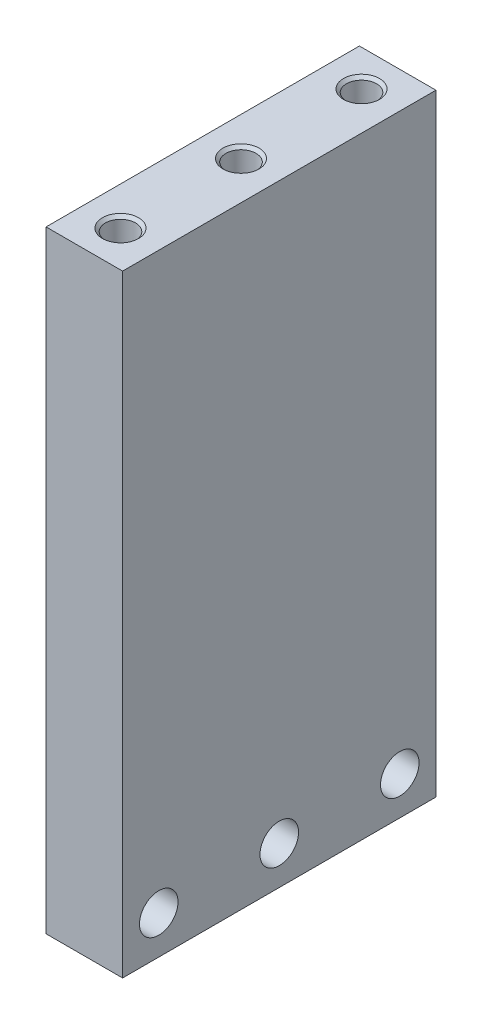
ISO-10303-21;
HEADER;
FILE_DESCRIPTION(('STEP AP214'),'2;1');
FILE_NAME('part.step','',(''),(''),'','','');
FILE_SCHEMA(('AUTOMOTIVE_DESIGN { 1 0 10303 214 1 1 1 1 }'));
ENDSEC;
DATA;
#1=APPLICATION_CONTEXT('core data for automotive mechanical design processes');
#2=APPLICATION_PROTOCOL_DEFINITION('international standard','automotive_design',2000,#1);
#3=PRODUCT_CONTEXT('',#1,'mechanical');
#4=PRODUCT('Part','Part','',(#3));
#5=PRODUCT_RELATED_PRODUCT_CATEGORY('part','',(#4));
#6=PRODUCT_DEFINITION_FORMATION('','',#4);
#7=PRODUCT_DEFINITION_CONTEXT('part definition',#1,'design');
#8=PRODUCT_DEFINITION('design','',#6,#7);
#9=PRODUCT_DEFINITION_SHAPE('','',#8);
#10=(LENGTH_UNIT() NAMED_UNIT(*) SI_UNIT(.MILLI.,.METRE.));
#11=(NAMED_UNIT(*) PLANE_ANGLE_UNIT() SI_UNIT($,.RADIAN.));
#12=(NAMED_UNIT(*) SI_UNIT($,.STERADIAN.) SOLID_ANGLE_UNIT());
#13=UNCERTAINTY_MEASURE_WITH_UNIT(LENGTH_MEASURE(1.E-05),#10,'distance_accuracy_value','');
#14=(GEOMETRIC_REPRESENTATION_CONTEXT(3) GLOBAL_UNCERTAINTY_ASSIGNED_CONTEXT((#13)) GLOBAL_UNIT_ASSIGNED_CONTEXT((#10,
#11,#12)) REPRESENTATION_CONTEXT('',''));
#15=CARTESIAN_POINT('',(0.,0.,0.));
#16=DIRECTION('',(0.,0.,1.));
#17=DIRECTION('',(1.,0.,0.));
#18=AXIS2_PLACEMENT_3D('',#15,#16,#17);
#19=CARTESIAN_POINT('',(0.,0.,26.));
#20=DIRECTION('',(1.,0.,0.));
#21=DIRECTION('',(0.,0.,-1.));
#22=AXIS2_PLACEMENT_3D('',#19,#20,#21);
#23=PLANE('',#22);
#24=CARTESIAN_POINT('',(0.,3.175,3.));
#25=DIRECTION('',(1.,0.,0.));
#26=DIRECTION('',(0.,0.,-1.));
#27=AXIS2_PLACEMENT_3D('',#24,#25,#26);
#28=CIRCLE('',#27,1.6);
#29=CARTESIAN_POINT('',(0.,3.175,1.4));
#30=VERTEX_POINT('',#29);
#31=EDGE_CURVE('E109',#30,#30,#28,.T.);
#32=ORIENTED_EDGE('',*,*,#31,.T.);
#33=EDGE_LOOP('',(#32));
#34=FACE_BOUND('',#33,.T.);
#35=CARTESIAN_POINT('',(0.,3.175,23.));
#36=DIRECTION('',(1.,0.,0.));
#37=DIRECTION('',(0.,0.,-1.));
#38=AXIS2_PLACEMENT_3D('',#35,#36,#37);
#39=CIRCLE('',#38,1.6);
#40=CARTESIAN_POINT('',(0.,3.175,21.4));
#41=VERTEX_POINT('',#40);
#42=EDGE_CURVE('E223',#41,#41,#39,.T.);
#43=ORIENTED_EDGE('',*,*,#42,.T.);
#44=EDGE_LOOP('',(#43));
#45=FACE_BOUND('',#44,.T.);
#46=CARTESIAN_POINT('',(0.,3.175,13.));
#47=DIRECTION('',(1.,0.,0.));
#48=DIRECTION('',(0.,0.,-1.));
#49=AXIS2_PLACEMENT_3D('',#46,#47,#48);
#50=CIRCLE('',#49,1.6);
#51=CARTESIAN_POINT('',(0.,3.175,11.4));
#52=VERTEX_POINT('',#51);
#53=EDGE_CURVE('E211',#52,#52,#50,.T.);
#54=ORIENTED_EDGE('',*,*,#53,.T.);
#55=EDGE_LOOP('',(#54));
#56=FACE_BOUND('',#55,.T.);
#57=DIRECTION('',(0.,-1.,0.));
#58=VECTOR('',#57,1.);
#59=CARTESIAN_POINT('',(0.,0.,0.));
#60=LINE('',#59,#58);
#61=CARTESIAN_POINT('',(0.,50.8,0.));
#62=VERTEX_POINT('',#61);
#63=CARTESIAN_POINT('',(0.,0.,0.));
#64=VERTEX_POINT('',#63);
#65=EDGE_CURVE('E106',#62,#64,#60,.T.);
#66=ORIENTED_EDGE('',*,*,#65,.T.);
#67=DIRECTION('',(0.,0.,-1.));
#68=VECTOR('',#67,1.);
#69=CARTESIAN_POINT('',(0.,0.,26.));
#70=LINE('',#69,#68);
#71=CARTESIAN_POINT('',(0.,0.,26.));
#72=VERTEX_POINT('',#71);
#73=EDGE_CURVE('E97',#72,#64,#70,.T.);
#74=ORIENTED_EDGE('',*,*,#73,.F.);
#75=DIRECTION('',(0.,-1.,0.));
#76=VECTOR('',#75,1.);
#77=CARTESIAN_POINT('',(0.,0.,26.));
#78=LINE('',#77,#76);
#79=CARTESIAN_POINT('',(0.,50.8,26.));
#80=VERTEX_POINT('',#79);
#81=EDGE_CURVE('E91',#80,#72,#78,.T.);
#82=ORIENTED_EDGE('',*,*,#81,.F.);
#83=DIRECTION('',(0.,0.,-1.));
#84=VECTOR('',#83,1.);
#85=CARTESIAN_POINT('',(0.,50.8,26.));
#86=LINE('',#85,#84);
#87=EDGE_CURVE('E102',#80,#62,#86,.T.);
#88=ORIENTED_EDGE('',*,*,#87,.T.);
#89=EDGE_LOOP('',(#66,#74,#82,#88));
#90=FACE_BOUND('',#89,.T.);
#91=ADVANCED_FACE('F38',(#34,#45,#56,#90),#23,.F.);
#92=CARTESIAN_POINT('',(0.,0.,26.));
#93=DIRECTION('',(0.,1.,0.));
#94=DIRECTION('',(0.,0.,1.));
#95=AXIS2_PLACEMENT_3D('',#92,#93,#94);
#96=PLANE('',#95);
#97=DIRECTION('',(1.,0.,0.));
#98=VECTOR('',#97,1.);
#99=CARTESIAN_POINT('',(0.,0.,0.));
#100=LINE('',#99,#98);
#101=CARTESIAN_POINT('',(6.35,0.,0.));
#102=VERTEX_POINT('',#101);
#103=EDGE_CURVE('E96',#64,#102,#100,.T.);
#104=ORIENTED_EDGE('',*,*,#103,.T.);
#105=DIRECTION('',(0.,0.,-1.));
#106=VECTOR('',#105,1.);
#107=CARTESIAN_POINT('',(6.35,0.,26.));
#108=LINE('',#107,#106);
#109=CARTESIAN_POINT('',(6.35,0.,26.));
#110=VERTEX_POINT('',#109);
#111=EDGE_CURVE('E94',#110,#102,#108,.T.);
#112=ORIENTED_EDGE('',*,*,#111,.F.);
#113=DIRECTION('',(1.,0.,0.));
#114=VECTOR('',#113,1.);
#115=CARTESIAN_POINT('',(0.,0.,26.));
#116=LINE('',#115,#114);
#117=EDGE_CURVE('E86',#72,#110,#116,.T.);
#118=ORIENTED_EDGE('',*,*,#117,.F.);
#119=ORIENTED_EDGE('',*,*,#73,.T.);
#120=EDGE_LOOP('',(#104,#112,#118,#119));
#121=FACE_BOUND('',#120,.T.);
#122=ADVANCED_FACE('F95',(#121),#96,.F.);
#123=CARTESIAN_POINT('',(6.35,0.,26.));
#124=DIRECTION('',(-1.,0.,0.));
#125=DIRECTION('',(0.,0.,1.));
#126=AXIS2_PLACEMENT_3D('',#123,#124,#125);
#127=PLANE('',#126);
#128=CARTESIAN_POINT('',(6.35,3.175,3.));
#129=DIRECTION('',(1.,0.,0.));
#130=DIRECTION('',(0.,0.,-1.));
#131=AXIS2_PLACEMENT_3D('',#128,#129,#130);
#132=CIRCLE('',#131,1.6);
#133=CARTESIAN_POINT('',(6.35,3.175,1.4));
#134=VERTEX_POINT('',#133);
#135=EDGE_CURVE('E220',#134,#134,#132,.T.);
#136=ORIENTED_EDGE('',*,*,#135,.F.);
#137=EDGE_LOOP('',(#136));
#138=FACE_BOUND('',#137,.T.);
#139=CARTESIAN_POINT('',(6.35,3.175,23.));
#140=DIRECTION('',(1.,0.,0.));
#141=DIRECTION('',(0.,0.,-1.));
#142=AXIS2_PLACEMENT_3D('',#139,#140,#141);
#143=CIRCLE('',#142,1.6);
#144=CARTESIAN_POINT('',(6.35,3.175,21.4));
#145=VERTEX_POINT('',#144);
#146=EDGE_CURVE('E226',#145,#145,#143,.T.);
#147=ORIENTED_EDGE('',*,*,#146,.F.);
#148=EDGE_LOOP('',(#147));
#149=FACE_BOUND('',#148,.T.);
#150=CARTESIAN_POINT('',(6.35,3.175,13.));
#151=DIRECTION('',(1.,0.,0.));
#152=DIRECTION('',(0.,0.,-1.));
#153=AXIS2_PLACEMENT_3D('',#150,#151,#152);
#154=CIRCLE('',#153,1.6);
#155=CARTESIAN_POINT('',(6.35,3.175,11.4));
#156=VERTEX_POINT('',#155);
#157=EDGE_CURVE('E207',#156,#156,#154,.T.);
#158=ORIENTED_EDGE('',*,*,#157,.F.);
#159=EDGE_LOOP('',(#158));
#160=FACE_BOUND('',#159,.T.);
#161=DIRECTION('',(0.,1.,0.));
#162=VECTOR('',#161,1.);
#163=CARTESIAN_POINT('',(6.35,0.,0.));
#164=LINE('',#163,#162);
#165=CARTESIAN_POINT('',(6.35,50.8,0.));
#166=VERTEX_POINT('',#165);
#167=EDGE_CURVE('E72',#102,#166,#164,.T.);
#168=ORIENTED_EDGE('',*,*,#167,.T.);
#169=DIRECTION('',(0.,0.,-1.));
#170=VECTOR('',#169,1.);
#171=CARTESIAN_POINT('',(6.35,50.8,26.));
#172=LINE('',#171,#170);
#173=CARTESIAN_POINT('',(6.35,50.8,26.));
#174=VERTEX_POINT('',#173);
#175=EDGE_CURVE('E98',#174,#166,#172,.T.);
#176=ORIENTED_EDGE('',*,*,#175,.F.);
#177=DIRECTION('',(0.,1.,0.));
#178=VECTOR('',#177,1.);
#179=CARTESIAN_POINT('',(6.35,0.,26.));
#180=LINE('',#179,#178);
#181=EDGE_CURVE('E89',#110,#174,#180,.T.);
#182=ORIENTED_EDGE('',*,*,#181,.F.);
#183=ORIENTED_EDGE('',*,*,#111,.T.);
#184=EDGE_LOOP('',(#168,#176,#182,#183));
#185=FACE_BOUND('',#184,.T.);
#186=ADVANCED_FACE('F100',(#138,#149,#160,#185),#127,.F.);
#187=CARTESIAN_POINT('',(0.,50.8,26.));
#188=DIRECTION('',(0.,-1.,0.));
#189=DIRECTION('',(0.,0.,-1.));
#190=AXIS2_PLACEMENT_3D('',#187,#188,#189);
#191=PLANE('',#190);
#192=CARTESIAN_POINT('',(3.17499999999991,50.8,23.));
#193=DIRECTION('',(0.,-1.,0.));
#194=DIRECTION('',(0.,0.,-1.));
#195=AXIS2_PLACEMENT_3D('',#192,#193,#194);
#196=CIRCLE('',#195,1.50000000000001);
#197=CARTESIAN_POINT('',(3.17499999999991,50.8,21.5));
#198=VERTEX_POINT('',#197);
#199=EDGE_CURVE('E125',#198,#198,#196,.T.);
#200=ORIENTED_EDGE('',*,*,#199,.T.);
#201=EDGE_LOOP('',(#200));
#202=FACE_BOUND('',#201,.T.);
#203=CARTESIAN_POINT('',(3.17499999999992,50.8,13.));
#204=DIRECTION('',(0.,-1.,0.));
#205=DIRECTION('',(0.,0.,-1.));
#206=AXIS2_PLACEMENT_3D('',#203,#204,#205);
#207=CIRCLE('',#206,1.49999999999999);
#208=CARTESIAN_POINT('',(3.17499999999992,50.8,11.5));
#209=VERTEX_POINT('',#208);
#210=EDGE_CURVE('E122',#209,#209,#207,.T.);
#211=ORIENTED_EDGE('',*,*,#210,.T.);
#212=EDGE_LOOP('',(#211));
#213=FACE_BOUND('',#212,.T.);
#214=CARTESIAN_POINT('',(3.17499999999993,50.8,3.));
#215=DIRECTION('',(0.,-1.,0.));
#216=DIRECTION('',(0.,0.,-1.));
#217=AXIS2_PLACEMENT_3D('',#214,#215,#216);
#218=CIRCLE('',#217,1.49999999999999);
#219=CARTESIAN_POINT('',(3.17499999999993,50.8,1.50000000000001));
#220=VERTEX_POINT('',#219);
#221=EDGE_CURVE('E119',#220,#220,#218,.T.);
#222=ORIENTED_EDGE('',*,*,#221,.T.);
#223=EDGE_LOOP('',(#222));
#224=FACE_BOUND('',#223,.T.);
#225=DIRECTION('',(-1.,0.,0.));
#226=VECTOR('',#225,1.);
#227=CARTESIAN_POINT('',(0.,50.8,0.));
#228=LINE('',#227,#226);
#229=EDGE_CURVE('E78',#166,#62,#228,.T.);
#230=ORIENTED_EDGE('',*,*,#229,.T.);
#231=ORIENTED_EDGE('',*,*,#87,.F.);
#232=DIRECTION('',(-1.,0.,0.));
#233=VECTOR('',#232,1.);
#234=CARTESIAN_POINT('',(0.,50.8,26.));
#235=LINE('',#234,#233);
#236=EDGE_CURVE('E55',#174,#80,#235,.T.);
#237=ORIENTED_EDGE('',*,*,#236,.F.);
#238=ORIENTED_EDGE('',*,*,#175,.T.);
#239=EDGE_LOOP('',(#230,#231,#237,#238));
#240=FACE_BOUND('',#239,.T.);
#241=ADVANCED_FACE('F158',(#202,#213,#224,#240),#191,.F.);
#242=CARTESIAN_POINT('',(0.,0.,26.));
#243=DIRECTION('',(0.,0.,-1.));
#244=DIRECTION('',(-1.,0.,0.));
#245=AXIS2_PLACEMENT_3D('',#242,#243,#244);
#246=PLANE('',#245);
#247=ORIENTED_EDGE('',*,*,#81,.T.);
#248=ORIENTED_EDGE('',*,*,#117,.T.);
#249=ORIENTED_EDGE('',*,*,#181,.T.);
#250=ORIENTED_EDGE('',*,*,#236,.T.);
#251=EDGE_LOOP('',(#247,#248,#249,#250));
#252=FACE_BOUND('',#251,.T.);
#253=ADVANCED_FACE('F87',(#252),#246,.F.);
#254=CARTESIAN_POINT('',(0.,0.,0.));
#255=DIRECTION('',(0.,0.,-1.));
#256=DIRECTION('',(-1.,0.,0.));
#257=AXIS2_PLACEMENT_3D('',#254,#255,#256);
#258=PLANE('',#257);
#259=ORIENTED_EDGE('',*,*,#65,.F.);
#260=ORIENTED_EDGE('',*,*,#229,.F.);
#261=ORIENTED_EDGE('',*,*,#167,.F.);
#262=ORIENTED_EDGE('',*,*,#103,.F.);
#263=EDGE_LOOP('',(#259,#260,#261,#262));
#264=FACE_BOUND('',#263,.T.);
#265=ADVANCED_FACE('F163',(#264),#258,.T.);
#266=CARTESIAN_POINT('',(0.,3.175,13.));
#267=DIRECTION('',(1.,0.,0.));
#268=DIRECTION('',(0.,0.,-1.));
#269=AXIS2_PLACEMENT_3D('',#266,#267,#268);
#270=CYLINDRICAL_SURFACE('',#269,1.6);
#271=ORIENTED_EDGE('',*,*,#53,.F.);
#272=EDGE_LOOP('',(#271));
#273=FACE_BOUND('',#272,.T.);
#274=ORIENTED_EDGE('',*,*,#157,.T.);
#275=EDGE_LOOP('',(#274));
#276=FACE_BOUND('',#275,.T.);
#277=ADVANCED_FACE('F166',(#273,#276),#270,.F.);
#278=CARTESIAN_POINT('',(0.,3.175,23.));
#279=DIRECTION('',(1.,0.,0.));
#280=DIRECTION('',(0.,0.,-1.));
#281=AXIS2_PLACEMENT_3D('',#278,#279,#280);
#282=CYLINDRICAL_SURFACE('',#281,1.6);
#283=ORIENTED_EDGE('',*,*,#42,.F.);
#284=EDGE_LOOP('',(#283));
#285=FACE_BOUND('',#284,.T.);
#286=ORIENTED_EDGE('',*,*,#146,.T.);
#287=EDGE_LOOP('',(#286));
#288=FACE_BOUND('',#287,.T.);
#289=ADVANCED_FACE('F172',(#285,#288),#282,.F.);
#290=CARTESIAN_POINT('',(0.,3.175,3.));
#291=DIRECTION('',(1.,0.,0.));
#292=DIRECTION('',(0.,0.,-1.));
#293=AXIS2_PLACEMENT_3D('',#290,#291,#292);
#294=CYLINDRICAL_SURFACE('',#293,1.6);
#295=ORIENTED_EDGE('',*,*,#31,.F.);
#296=EDGE_LOOP('',(#295));
#297=FACE_BOUND('',#296,.T.);
#298=ORIENTED_EDGE('',*,*,#135,.T.);
#299=EDGE_LOOP('',(#298));
#300=FACE_BOUND('',#299,.T.);
#301=ADVANCED_FACE('F176',(#297,#300),#294,.F.);
#302=CARTESIAN_POINT('',(3.17499999999993,45.8,3.));
#303=DIRECTION('',(0.,1.,0.));
#304=DIRECTION('',(0.,0.,1.));
#305=AXIS2_PLACEMENT_3D('',#302,#303,#304);
#306=CYLINDRICAL_SURFACE('',#305,1.25);
#307=CARTESIAN_POINT('',(3.17499999999993,50.55,3.));
#308=DIRECTION('',(0.,-1.,0.));
#309=DIRECTION('',(0.,0.,-1.));
#310=AXIS2_PLACEMENT_3D('',#307,#308,#309);
#311=CIRCLE('',#310,1.25);
#312=CARTESIAN_POINT('',(3.17499999999993,50.55,1.75));
#313=VERTEX_POINT('',#312);
#314=EDGE_CURVE('E11',#313,#313,#311,.F.);
#315=ORIENTED_EDGE('',*,*,#314,.T.);
#316=EDGE_LOOP('',(#315));
#317=FACE_BOUND('',#316,.T.);
#318=CARTESIAN_POINT('',(3.17499999999993,45.8,3.));
#319=DIRECTION('',(0.,1.,0.));
#320=DIRECTION('',(0.,0.,1.));
#321=AXIS2_PLACEMENT_3D('',#318,#319,#320);
#322=CIRCLE('',#321,1.25);
#323=CARTESIAN_POINT('',(3.17499999999993,45.8,4.25));
#324=VERTEX_POINT('',#323);
#325=EDGE_CURVE('E214',#324,#324,#322,.T.);
#326=ORIENTED_EDGE('',*,*,#325,.F.);
#327=EDGE_LOOP('',(#326));
#328=FACE_BOUND('',#327,.T.);
#329=ADVANCED_FACE('F180',(#317,#328),#306,.F.);
#330=CARTESIAN_POINT('',(3.17499999999993,45.8,3.));
#331=DIRECTION('',(0.,1.,0.));
#332=DIRECTION('',(0.,0.,1.));
#333=AXIS2_PLACEMENT_3D('',#330,#331,#332);
#334=PLANE('',#333);
#335=ORIENTED_EDGE('',*,*,#325,.T.);
#336=EDGE_LOOP('',(#335));
#337=FACE_BOUND('',#336,.T.);
#338=ADVANCED_FACE('F184',(#337),#334,.T.);
#339=CARTESIAN_POINT('',(3.17499999999992,45.8,13.));
#340=DIRECTION('',(0.,1.,0.));
#341=DIRECTION('',(0.,0.,1.));
#342=AXIS2_PLACEMENT_3D('',#339,#340,#341);
#343=CYLINDRICAL_SURFACE('',#342,1.25);
#344=CARTESIAN_POINT('',(3.17499999999992,50.55,13.));
#345=DIRECTION('',(0.,-1.,0.));
#346=DIRECTION('',(0.,0.,-1.));
#347=AXIS2_PLACEMENT_3D('',#344,#345,#346);
#348=CIRCLE('',#347,1.25);
#349=CARTESIAN_POINT('',(3.17499999999992,50.55,11.75));
#350=VERTEX_POINT('',#349);
#351=EDGE_CURVE('E47',#350,#350,#348,.F.);
#352=ORIENTED_EDGE('',*,*,#351,.T.);
#353=EDGE_LOOP('',(#352));
#354=FACE_BOUND('',#353,.T.);
#355=CARTESIAN_POINT('',(3.17499999999992,45.8,13.));
#356=DIRECTION('',(0.,1.,0.));
#357=DIRECTION('',(0.,0.,1.));
#358=AXIS2_PLACEMENT_3D('',#355,#356,#357);
#359=CIRCLE('',#358,1.25);
#360=CARTESIAN_POINT('',(3.17499999999992,45.8,14.25));
#361=VERTEX_POINT('',#360);
#362=EDGE_CURVE('E208',#361,#361,#359,.T.);
#363=ORIENTED_EDGE('',*,*,#362,.F.);
#364=EDGE_LOOP('',(#363));
#365=FACE_BOUND('',#364,.T.);
#366=ADVANCED_FACE('F130',(#354,#365),#343,.F.);
#367=CARTESIAN_POINT('',(3.17499999999992,45.8,13.));
#368=DIRECTION('',(0.,1.,0.));
#369=DIRECTION('',(0.,0.,1.));
#370=AXIS2_PLACEMENT_3D('',#367,#368,#369);
#371=PLANE('',#370);
#372=ORIENTED_EDGE('',*,*,#362,.T.);
#373=EDGE_LOOP('',(#372));
#374=FACE_BOUND('',#373,.T.);
#375=ADVANCED_FACE('F191',(#374),#371,.T.);
#376=CARTESIAN_POINT('',(3.17499999999991,45.8,23.));
#377=DIRECTION('',(0.,1.,0.));
#378=DIRECTION('',(0.,0.,1.));
#379=AXIS2_PLACEMENT_3D('',#376,#377,#378);
#380=CYLINDRICAL_SURFACE('',#379,1.25);
#381=CARTESIAN_POINT('',(3.17499999999991,50.55,23.));
#382=DIRECTION('',(0.,-1.,0.));
#383=DIRECTION('',(0.,0.,-1.));
#384=AXIS2_PLACEMENT_3D('',#381,#382,#383);
#385=CIRCLE('',#384,1.25);
#386=CARTESIAN_POINT('',(3.17499999999991,50.55,21.75));
#387=VERTEX_POINT('',#386);
#388=EDGE_CURVE('E116',#387,#387,#385,.F.);
#389=ORIENTED_EDGE('',*,*,#388,.T.);
#390=EDGE_LOOP('',(#389));
#391=FACE_BOUND('',#390,.T.);
#392=CARTESIAN_POINT('',(3.17499999999991,45.8,23.));
#393=DIRECTION('',(0.,1.,0.));
#394=DIRECTION('',(0.,0.,1.));
#395=AXIS2_PLACEMENT_3D('',#392,#393,#394);
#396=CIRCLE('',#395,1.25);
#397=CARTESIAN_POINT('',(3.17499999999991,45.8,24.25));
#398=VERTEX_POINT('',#397);
#399=EDGE_CURVE('E205',#398,#398,#396,.T.);
#400=ORIENTED_EDGE('',*,*,#399,.F.);
#401=EDGE_LOOP('',(#400));
#402=FACE_BOUND('',#401,.T.);
#403=ADVANCED_FACE('F194',(#391,#402),#380,.F.);
#404=CARTESIAN_POINT('',(3.17499999999991,45.8,23.));
#405=DIRECTION('',(0.,1.,0.));
#406=DIRECTION('',(0.,0.,1.));
#407=AXIS2_PLACEMENT_3D('',#404,#405,#406);
#408=PLANE('',#407);
#409=ORIENTED_EDGE('',*,*,#399,.T.);
#410=EDGE_LOOP('',(#409));
#411=FACE_BOUND('',#410,.T.);
#412=ADVANCED_FACE('F142',(#411),#408,.T.);
#413=CARTESIAN_POINT('',(3.17499999999991,50.55,23.));
#414=DIRECTION('',(0.,1.,0.));
#415=DIRECTION('',(0.,0.,1.));
#416=AXIS2_PLACEMENT_3D('',#413,#414,#415);
#417=CONICAL_SURFACE('',#416,1.25,0.785398163397463);
#418=ORIENTED_EDGE('',*,*,#199,.F.);
#419=EDGE_LOOP('',(#418));
#420=FACE_BOUND('',#419,.T.);
#421=ORIENTED_EDGE('',*,*,#388,.F.);
#422=EDGE_LOOP('',(#421));
#423=FACE_BOUND('',#422,.T.);
#424=ADVANCED_FACE('F135',(#420,#423),#417,.F.);
#425=CARTESIAN_POINT('',(3.17499999999992,50.55,13.));
#426=DIRECTION('',(0.,1.,0.));
#427=DIRECTION('',(0.,0.,1.));
#428=AXIS2_PLACEMENT_3D('',#425,#426,#427);
#429=CONICAL_SURFACE('',#428,1.25,0.785398163397447);
#430=ORIENTED_EDGE('',*,*,#210,.F.);
#431=EDGE_LOOP('',(#430));
#432=FACE_BOUND('',#431,.T.);
#433=ORIENTED_EDGE('',*,*,#351,.F.);
#434=EDGE_LOOP('',(#433));
#435=FACE_BOUND('',#434,.T.);
#436=ADVANCED_FACE('F133',(#432,#435),#429,.F.);
#437=CARTESIAN_POINT('',(3.17499999999993,50.55,3.));
#438=DIRECTION('',(0.,1.,0.));
#439=DIRECTION('',(0.,0.,1.));
#440=AXIS2_PLACEMENT_3D('',#437,#438,#439);
#441=CONICAL_SURFACE('',#440,1.25,0.785398163397438);
#442=ORIENTED_EDGE('',*,*,#221,.F.);
#443=EDGE_LOOP('',(#442));
#444=FACE_BOUND('',#443,.T.);
#445=ORIENTED_EDGE('',*,*,#314,.F.);
#446=EDGE_LOOP('',(#445));
#447=FACE_BOUND('',#446,.T.);
#448=ADVANCED_FACE('F40',(#444,#447),#441,.F.);
#449=CLOSED_SHELL('',(#91,#122,#186,#241,#253,#265,#277,#289,#301,#329,#338,#366,#375,#403,#412,
#424,#436,#448));
#450=MANIFOLD_SOLID_BREP('B2',#449);
#451=ADVANCED_BREP_SHAPE_REPRESENTATION('',(#18,#450),#14);
#452=SHAPE_DEFINITION_REPRESENTATION(#9,#451);
ENDSEC;
END-ISO-10303-21;
